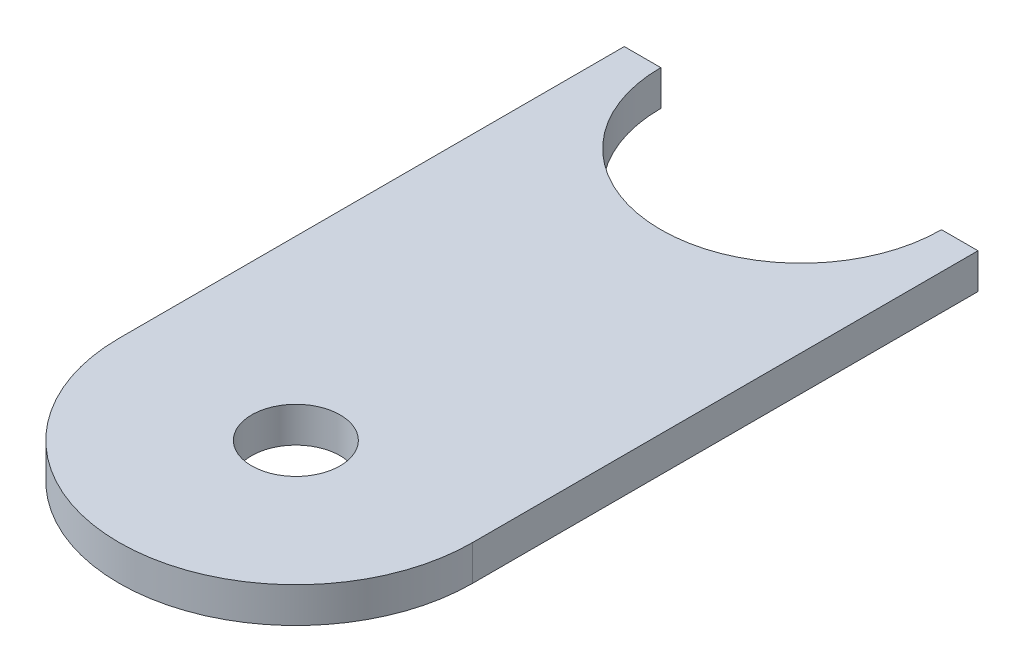
ISO-10303-21;
HEADER;
FILE_DESCRIPTION(('STEP AP214'),'2;1');
FILE_NAME('part.step','',(''),(''),'','','');
FILE_SCHEMA(('AUTOMOTIVE_DESIGN { 1 0 10303 214 1 1 1 1 }'));
ENDSEC;
DATA;
#1=APPLICATION_CONTEXT('core data for automotive mechanical design processes');
#2=APPLICATION_PROTOCOL_DEFINITION('international standard','automotive_design',2000,#1);
#3=PRODUCT_CONTEXT('',#1,'mechanical');
#4=PRODUCT('Part','Part','',(#3));
#5=PRODUCT_RELATED_PRODUCT_CATEGORY('part','',(#4));
#6=PRODUCT_DEFINITION_FORMATION('','',#4);
#7=PRODUCT_DEFINITION_CONTEXT('part definition',#1,'design');
#8=PRODUCT_DEFINITION('design','',#6,#7);
#9=PRODUCT_DEFINITION_SHAPE('','',#8);
#10=(LENGTH_UNIT() NAMED_UNIT(*) SI_UNIT(.MILLI.,.METRE.));
#11=(NAMED_UNIT(*) PLANE_ANGLE_UNIT() SI_UNIT($,.RADIAN.));
#12=(NAMED_UNIT(*) SI_UNIT($,.STERADIAN.) SOLID_ANGLE_UNIT());
#13=UNCERTAINTY_MEASURE_WITH_UNIT(LENGTH_MEASURE(1.E-05),#10,'distance_accuracy_value','');
#14=(GEOMETRIC_REPRESENTATION_CONTEXT(3) GLOBAL_UNCERTAINTY_ASSIGNED_CONTEXT((#13)) GLOBAL_UNIT_ASSIGNED_CONTEXT((#10,
#11,#12)) REPRESENTATION_CONTEXT('',''));
#15=CARTESIAN_POINT('',(0.,0.,0.));
#16=DIRECTION('',(0.,0.,1.));
#17=DIRECTION('',(1.,0.,0.));
#18=AXIS2_PLACEMENT_3D('',#15,#16,#17);
#19=CARTESIAN_POINT('',(0.,4.,0.));
#20=DIRECTION('',(0.,-1.,0.));
#21=DIRECTION('',(0.,0.,-1.));
#22=AXIS2_PLACEMENT_3D('',#19,#20,#21);
#23=PLANE('',#22);
#24=DIRECTION('',(-1.,0.,0.));
#25=VECTOR('',#24,1.);
#26=CARTESIAN_POINT('',(-20.,4.,0.));
#27=LINE('',#26,#25);
#28=CARTESIAN_POINT('',(-15.875,4.,0.));
#29=VERTEX_POINT('',#28);
#30=CARTESIAN_POINT('',(-20.,4.,0.));
#31=VERTEX_POINT('',#30);
#32=EDGE_CURVE('E130',#29,#31,#27,.T.);
#33=ORIENTED_EDGE('',*,*,#32,.T.);
#34=DIRECTION('',(0.,0.,1.));
#35=VECTOR('',#34,1.);
#36=CARTESIAN_POINT('',(-20.,4.,57.1428571428571));
#37=LINE('',#36,#35);
#38=CARTESIAN_POINT('',(-20.,4.,57.1428571428571));
#39=VERTEX_POINT('',#38);
#40=EDGE_CURVE('E88',#31,#39,#37,.T.);
#41=ORIENTED_EDGE('',*,*,#40,.T.);
#42=CARTESIAN_POINT('',(0.,4.,57.1428571428571));
#43=DIRECTION('',(0.,1.,0.));
#44=DIRECTION('',(0.,0.,-1.));
#45=AXIS2_PLACEMENT_3D('',#42,#43,#44);
#46=CIRCLE('',#45,20.);
#47=CARTESIAN_POINT('',(20.,4.,57.1428571428571));
#48=VERTEX_POINT('',#47);
#49=EDGE_CURVE('E101',#39,#48,#46,.T.);
#50=ORIENTED_EDGE('',*,*,#49,.T.);
#51=DIRECTION('',(0.,0.,-1.));
#52=VECTOR('',#51,1.);
#53=CARTESIAN_POINT('',(20.,4.,0.));
#54=LINE('',#53,#52);
#55=CARTESIAN_POINT('',(20.,4.,0.));
#56=VERTEX_POINT('',#55);
#57=EDGE_CURVE('E95',#48,#56,#54,.T.);
#58=ORIENTED_EDGE('',*,*,#57,.T.);
#59=DIRECTION('',(-1.,0.,0.));
#60=VECTOR('',#59,1.);
#61=CARTESIAN_POINT('',(20.,4.,0.));
#62=LINE('',#61,#60);
#63=CARTESIAN_POINT('',(15.875,4.,0.));
#64=VERTEX_POINT('',#63);
#65=EDGE_CURVE('E99',#56,#64,#62,.T.);
#66=ORIENTED_EDGE('',*,*,#65,.T.);
#67=CARTESIAN_POINT('',(0.,4.,0.));
#68=DIRECTION('',(0.,-1.,0.));
#69=DIRECTION('',(0.,0.,-1.));
#70=AXIS2_PLACEMENT_3D('',#67,#68,#69);
#71=CIRCLE('',#70,15.875);
#72=EDGE_CURVE('E51',#64,#29,#71,.T.);
#73=ORIENTED_EDGE('',*,*,#72,.T.);
#74=EDGE_LOOP('',(#33,#41,#50,#58,#66,#73));
#75=FACE_BOUND('',#74,.T.);
#76=CARTESIAN_POINT('',(0.,4.,57.1428571428571));
#77=DIRECTION('',(0.,1.,0.));
#78=DIRECTION('',(0.,0.,1.));
#79=AXIS2_PLACEMENT_3D('',#76,#77,#78);
#80=CIRCLE('',#79,5.);
#81=CARTESIAN_POINT('',(0.,4.,62.1428571428571));
#82=VERTEX_POINT('',#81);
#83=EDGE_CURVE('E123',#82,#82,#80,.T.);
#84=ORIENTED_EDGE('',*,*,#83,.F.);
#85=EDGE_LOOP('',(#84));
#86=FACE_BOUND('',#85,.T.);
#87=ADVANCED_FACE('F34',(#75,#86),#23,.F.);
#88=CARTESIAN_POINT('',(0.,0.,0.));
#89=DIRECTION('',(0.,-1.,0.));
#90=DIRECTION('',(0.,0.,-1.));
#91=AXIS2_PLACEMENT_3D('',#88,#89,#90);
#92=PLANE('',#91);
#93=DIRECTION('',(-1.,0.,0.));
#94=VECTOR('',#93,1.);
#95=CARTESIAN_POINT('',(-20.,0.,0.));
#96=LINE('',#95,#94);
#97=CARTESIAN_POINT('',(-15.875,0.,0.));
#98=VERTEX_POINT('',#97);
#99=CARTESIAN_POINT('',(-20.,0.,0.));
#100=VERTEX_POINT('',#99);
#101=EDGE_CURVE('E119',#98,#100,#96,.T.);
#102=ORIENTED_EDGE('',*,*,#101,.F.);
#103=CARTESIAN_POINT('',(0.,0.,0.));
#104=DIRECTION('',(0.,-1.,0.));
#105=DIRECTION('',(0.,0.,-1.));
#106=AXIS2_PLACEMENT_3D('',#103,#104,#105);
#107=CIRCLE('',#106,15.875);
#108=CARTESIAN_POINT('',(15.875,0.,0.));
#109=VERTEX_POINT('',#108);
#110=EDGE_CURVE('E80',#109,#98,#107,.T.);
#111=ORIENTED_EDGE('',*,*,#110,.F.);
#112=DIRECTION('',(-1.,0.,0.));
#113=VECTOR('',#112,1.);
#114=CARTESIAN_POINT('',(20.,0.,0.));
#115=LINE('',#114,#113);
#116=CARTESIAN_POINT('',(20.,0.,0.));
#117=VERTEX_POINT('',#116);
#118=EDGE_CURVE('E74',#117,#109,#115,.T.);
#119=ORIENTED_EDGE('',*,*,#118,.F.);
#120=DIRECTION('',(0.,0.,-1.));
#121=VECTOR('',#120,1.);
#122=CARTESIAN_POINT('',(20.,0.,0.));
#123=LINE('',#122,#121);
#124=CARTESIAN_POINT('',(20.,0.,57.1428571428571));
#125=VERTEX_POINT('',#124);
#126=EDGE_CURVE('E109',#125,#117,#123,.T.);
#127=ORIENTED_EDGE('',*,*,#126,.F.);
#128=CARTESIAN_POINT('',(0.,0.,57.1428571428571));
#129=DIRECTION('',(0.,1.,0.));
#130=DIRECTION('',(0.,0.,-1.));
#131=AXIS2_PLACEMENT_3D('',#128,#129,#130);
#132=CIRCLE('',#131,20.);
#133=CARTESIAN_POINT('',(-20.,0.,57.1428571428571));
#134=VERTEX_POINT('',#133);
#135=EDGE_CURVE('E125',#134,#125,#132,.T.);
#136=ORIENTED_EDGE('',*,*,#135,.F.);
#137=DIRECTION('',(0.,0.,1.));
#138=VECTOR('',#137,1.);
#139=CARTESIAN_POINT('',(-20.,0.,57.1428571428571));
#140=LINE('',#139,#138);
#141=EDGE_CURVE('E122',#100,#134,#140,.T.);
#142=ORIENTED_EDGE('',*,*,#141,.F.);
#143=EDGE_LOOP('',(#102,#111,#119,#127,#136,#142));
#144=FACE_BOUND('',#143,.T.);
#145=CARTESIAN_POINT('',(0.,0.,57.1428571428571));
#146=DIRECTION('',(0.,1.,0.));
#147=DIRECTION('',(0.,0.,1.));
#148=AXIS2_PLACEMENT_3D('',#145,#146,#147);
#149=CIRCLE('',#148,5.);
#150=CARTESIAN_POINT('',(0.,0.,62.1428571428571));
#151=VERTEX_POINT('',#150);
#152=EDGE_CURVE('E223',#151,#151,#149,.T.);
#153=ORIENTED_EDGE('',*,*,#152,.T.);
#154=EDGE_LOOP('',(#153));
#155=FACE_BOUND('',#154,.T.);
#156=ADVANCED_FACE('F139',(#144,#155),#92,.T.);
#157=CARTESIAN_POINT('',(-20.,4.,0.));
#158=DIRECTION('',(0.,0.,1.));
#159=DIRECTION('',(1.,0.,0.));
#160=AXIS2_PLACEMENT_3D('',#157,#158,#159);
#161=PLANE('',#160);
#162=ORIENTED_EDGE('',*,*,#101,.T.);
#163=DIRECTION('',(0.,-1.,0.));
#164=VECTOR('',#163,1.);
#165=CARTESIAN_POINT('',(-20.,4.,0.));
#166=LINE('',#165,#164);
#167=EDGE_CURVE('E11',#31,#100,#166,.T.);
#168=ORIENTED_EDGE('',*,*,#167,.F.);
#169=ORIENTED_EDGE('',*,*,#32,.F.);
#170=DIRECTION('',(0.,-1.,0.));
#171=VECTOR('',#170,1.);
#172=CARTESIAN_POINT('',(-15.875,4.,0.));
#173=LINE('',#172,#171);
#174=EDGE_CURVE('E115',#29,#98,#173,.T.);
#175=ORIENTED_EDGE('',*,*,#174,.T.);
#176=EDGE_LOOP('',(#162,#168,#169,#175));
#177=FACE_BOUND('',#176,.T.);
#178=ADVANCED_FACE('F36',(#177),#161,.F.);
#179=CARTESIAN_POINT('',(-20.,4.,57.1428571428571));
#180=DIRECTION('',(1.,0.,0.));
#181=DIRECTION('',(0.,0.,-1.));
#182=AXIS2_PLACEMENT_3D('',#179,#180,#181);
#183=PLANE('',#182);
#184=ORIENTED_EDGE('',*,*,#141,.T.);
#185=DIRECTION('',(0.,-1.,0.));
#186=VECTOR('',#185,1.);
#187=CARTESIAN_POINT('',(-20.,4.,57.1428571428571));
#188=LINE('',#187,#186);
#189=EDGE_CURVE('E43',#39,#134,#188,.T.);
#190=ORIENTED_EDGE('',*,*,#189,.F.);
#191=ORIENTED_EDGE('',*,*,#40,.F.);
#192=ORIENTED_EDGE('',*,*,#167,.T.);
#193=EDGE_LOOP('',(#184,#190,#191,#192));
#194=FACE_BOUND('',#193,.T.);
#195=ADVANCED_FACE('F164',(#194),#183,.F.);
#196=CARTESIAN_POINT('',(0.,4.,57.1428571428571));
#197=DIRECTION('',(0.,-1.,0.));
#198=DIRECTION('',(0.,0.,-1.));
#199=AXIS2_PLACEMENT_3D('',#196,#197,#198);
#200=CYLINDRICAL_SURFACE('',#199,20.);
#201=ORIENTED_EDGE('',*,*,#135,.T.);
#202=DIRECTION('',(0.,-1.,0.));
#203=VECTOR('',#202,1.);
#204=CARTESIAN_POINT('',(20.,4.,57.1428571428571));
#205=LINE('',#204,#203);
#206=EDGE_CURVE('E110',#48,#125,#205,.T.);
#207=ORIENTED_EDGE('',*,*,#206,.F.);
#208=ORIENTED_EDGE('',*,*,#49,.F.);
#209=ORIENTED_EDGE('',*,*,#189,.T.);
#210=EDGE_LOOP('',(#201,#207,#208,#209));
#211=FACE_BOUND('',#210,.T.);
#212=ADVANCED_FACE('F136',(#211),#200,.T.);
#213=CARTESIAN_POINT('',(20.,4.,0.));
#214=DIRECTION('',(-1.,0.,0.));
#215=DIRECTION('',(0.,0.,1.));
#216=AXIS2_PLACEMENT_3D('',#213,#214,#215);
#217=PLANE('',#216);
#218=ORIENTED_EDGE('',*,*,#126,.T.);
#219=DIRECTION('',(0.,-1.,0.));
#220=VECTOR('',#219,1.);
#221=CARTESIAN_POINT('',(20.,4.,0.));
#222=LINE('',#221,#220);
#223=EDGE_CURVE('E106',#56,#117,#222,.T.);
#224=ORIENTED_EDGE('',*,*,#223,.F.);
#225=ORIENTED_EDGE('',*,*,#57,.F.);
#226=ORIENTED_EDGE('',*,*,#206,.T.);
#227=EDGE_LOOP('',(#218,#224,#225,#226));
#228=FACE_BOUND('',#227,.T.);
#229=ADVANCED_FACE('F107',(#228),#217,.F.);
#230=CARTESIAN_POINT('',(20.,4.,0.));
#231=DIRECTION('',(0.,0.,1.));
#232=DIRECTION('',(1.,0.,0.));
#233=AXIS2_PLACEMENT_3D('',#230,#231,#232);
#234=PLANE('',#233);
#235=ORIENTED_EDGE('',*,*,#118,.T.);
#236=DIRECTION('',(0.,-1.,0.));
#237=VECTOR('',#236,1.);
#238=CARTESIAN_POINT('',(15.875,4.,0.));
#239=LINE('',#238,#237);
#240=EDGE_CURVE('E111',#64,#109,#239,.T.);
#241=ORIENTED_EDGE('',*,*,#240,.F.);
#242=ORIENTED_EDGE('',*,*,#65,.F.);
#243=ORIENTED_EDGE('',*,*,#223,.T.);
#244=EDGE_LOOP('',(#235,#241,#242,#243));
#245=FACE_BOUND('',#244,.T.);
#246=ADVANCED_FACE('F113',(#245),#234,.F.);
#247=CARTESIAN_POINT('',(0.,4.,0.));
#248=DIRECTION('',(0.,-1.,0.));
#249=DIRECTION('',(0.,0.,-1.));
#250=AXIS2_PLACEMENT_3D('',#247,#248,#249);
#251=CYLINDRICAL_SURFACE('',#250,15.875);
#252=ORIENTED_EDGE('',*,*,#110,.T.);
#253=ORIENTED_EDGE('',*,*,#174,.F.);
#254=ORIENTED_EDGE('',*,*,#72,.F.);
#255=ORIENTED_EDGE('',*,*,#240,.T.);
#256=EDGE_LOOP('',(#252,#253,#254,#255));
#257=FACE_BOUND('',#256,.T.);
#258=ADVANCED_FACE('F144',(#257),#251,.F.);
#259=CARTESIAN_POINT('',(0.,4.,57.1428571428571));
#260=DIRECTION('',(0.,-1.,0.));
#261=DIRECTION('',(0.,0.,-1.));
#262=AXIS2_PLACEMENT_3D('',#259,#260,#261);
#263=CYLINDRICAL_SURFACE('',#262,5.);
#264=ORIENTED_EDGE('',*,*,#83,.T.);
#265=EDGE_LOOP('',(#264));
#266=FACE_BOUND('',#265,.T.);
#267=ORIENTED_EDGE('',*,*,#152,.F.);
#268=EDGE_LOOP('',(#267));
#269=FACE_BOUND('',#268,.T.);
#270=ADVANCED_FACE('F146',(#266,#269),#263,.F.);
#271=CLOSED_SHELL('',(#87,#156,#178,#195,#212,#229,#246,#258,#270));
#272=MANIFOLD_SOLID_BREP('B2',#271);
#273=ADVANCED_BREP_SHAPE_REPRESENTATION('',(#18,#272),#14);
#274=SHAPE_DEFINITION_REPRESENTATION(#9,#273);
ENDSEC;
END-ISO-10303-21;
